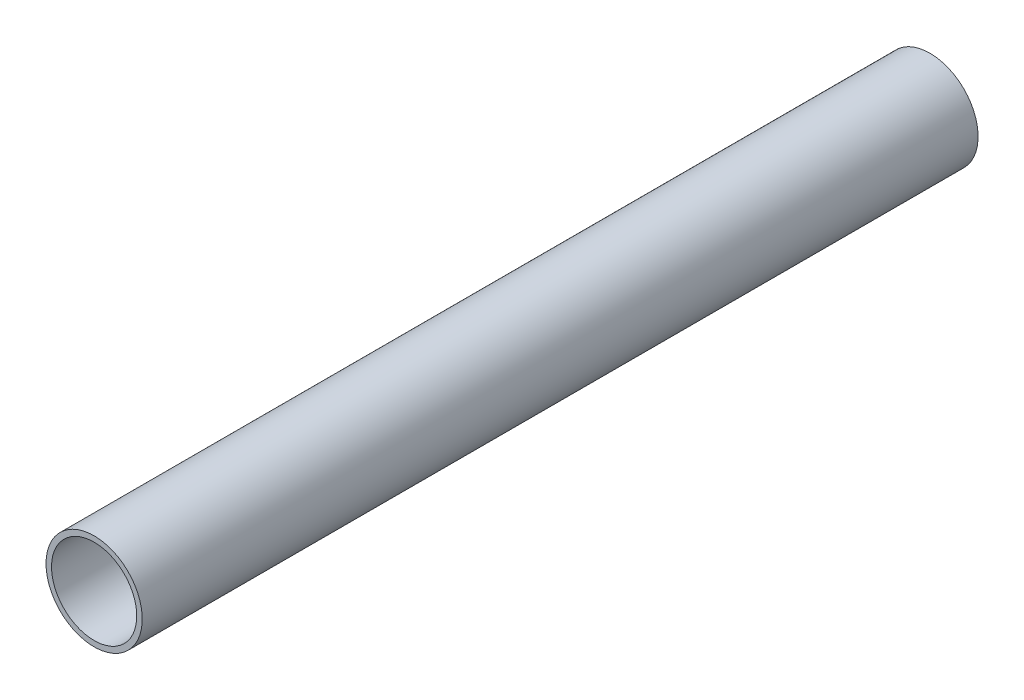
ISO-10303-21;
HEADER;
FILE_DESCRIPTION(('STEP AP214'),'2;1');
FILE_NAME('part.step','',(''),(''),'','','');
FILE_SCHEMA(('AUTOMOTIVE_DESIGN { 1 0 10303 214 1 1 1 1 }'));
ENDSEC;
DATA;
#1=APPLICATION_CONTEXT('core data for automotive mechanical design processes');
#2=APPLICATION_PROTOCOL_DEFINITION('international standard','automotive_design',2000,#1);
#3=PRODUCT_CONTEXT('',#1,'mechanical');
#4=PRODUCT('Part','Part','',(#3));
#5=PRODUCT_RELATED_PRODUCT_CATEGORY('part','',(#4));
#6=PRODUCT_DEFINITION_FORMATION('','',#4);
#7=PRODUCT_DEFINITION_CONTEXT('part definition',#1,'design');
#8=PRODUCT_DEFINITION('design','',#6,#7);
#9=PRODUCT_DEFINITION_SHAPE('','',#8);
#10=(LENGTH_UNIT() NAMED_UNIT(*) SI_UNIT(.MILLI.,.METRE.));
#11=(NAMED_UNIT(*) PLANE_ANGLE_UNIT() SI_UNIT($,.RADIAN.));
#12=(NAMED_UNIT(*) SI_UNIT($,.STERADIAN.) SOLID_ANGLE_UNIT());
#13=UNCERTAINTY_MEASURE_WITH_UNIT(LENGTH_MEASURE(1.E-05),#10,'distance_accuracy_value','');
#14=(GEOMETRIC_REPRESENTATION_CONTEXT(3) GLOBAL_UNCERTAINTY_ASSIGNED_CONTEXT((#13)) GLOBAL_UNIT_ASSIGNED_CONTEXT((#10,
#11,#12)) REPRESENTATION_CONTEXT('',''));
#15=CARTESIAN_POINT('',(0.,0.,0.));
#16=DIRECTION('',(0.,0.,1.));
#17=DIRECTION('',(1.,0.,0.));
#18=AXIS2_PLACEMENT_3D('',#15,#16,#17);
#19=CARTESIAN_POINT('',(0.,0.,455.));
#20=DIRECTION('',(0.,0.,1.));
#21=DIRECTION('',(1.,0.,0.));
#22=AXIS2_PLACEMENT_3D('',#19,#20,#21);
#23=PLANE('',#22);
#24=CARTESIAN_POINT('',(0.,0.,455.));
#25=DIRECTION('',(0.,0.,1.));
#26=DIRECTION('',(1.,0.,0.));
#27=AXIS2_PLACEMENT_3D('',#24,#25,#26);
#28=CIRCLE('',#27,26.2);
#29=CARTESIAN_POINT('',(-26.2,0.,455.));
#30=VERTEX_POINT('',#29);
#31=EDGE_CURVE('E10',#30,#30,#28,.T.);
#32=ORIENTED_EDGE('',*,*,#31,.T.);
#33=EDGE_LOOP('',(#32));
#34=FACE_BOUND('',#33,.T.);
#35=CARTESIAN_POINT('',(0.,0.,455.));
#36=DIRECTION('',(0.,0.,1.));
#37=DIRECTION('',(1.,0.,0.));
#38=AXIS2_PLACEMENT_3D('',#35,#36,#37);
#39=CIRCLE('',#38,23.2);
#40=CARTESIAN_POINT('',(-23.2,0.,455.));
#41=VERTEX_POINT('',#40);
#42=EDGE_CURVE('E51',#41,#41,#39,.T.);
#43=ORIENTED_EDGE('',*,*,#42,.F.);
#44=EDGE_LOOP('',(#43));
#45=FACE_BOUND('',#44,.T.);
#46=ADVANCED_FACE('F37',(#34,#45),#23,.T.);
#47=CARTESIAN_POINT('',(0.,0.,0.));
#48=DIRECTION('',(0.,0.,1.));
#49=DIRECTION('',(1.,0.,0.));
#50=AXIS2_PLACEMENT_3D('',#47,#48,#49);
#51=PLANE('',#50);
#52=CARTESIAN_POINT('',(0.,0.,0.));
#53=DIRECTION('',(0.,0.,1.));
#54=DIRECTION('',(1.,0.,0.));
#55=AXIS2_PLACEMENT_3D('',#52,#53,#54);
#56=CIRCLE('',#55,26.2);
#57=CARTESIAN_POINT('',(-26.2,0.,0.));
#58=VERTEX_POINT('',#57);
#59=EDGE_CURVE('E41',#58,#58,#56,.T.);
#60=ORIENTED_EDGE('',*,*,#59,.F.);
#61=EDGE_LOOP('',(#60));
#62=FACE_BOUND('',#61,.T.);
#63=CARTESIAN_POINT('',(0.,0.,0.));
#64=DIRECTION('',(0.,0.,1.));
#65=DIRECTION('',(1.,0.,0.));
#66=AXIS2_PLACEMENT_3D('',#63,#64,#65);
#67=CIRCLE('',#66,23.2);
#68=CARTESIAN_POINT('',(-23.2,0.,0.));
#69=VERTEX_POINT('',#68);
#70=EDGE_CURVE('E53',#69,#69,#67,.T.);
#71=ORIENTED_EDGE('',*,*,#70,.T.);
#72=EDGE_LOOP('',(#71));
#73=FACE_BOUND('',#72,.T.);
#74=ADVANCED_FACE('F66',(#62,#73),#51,.F.);
#75=CARTESIAN_POINT('',(0.,0.,455.));
#76=DIRECTION('',(0.,0.,-1.));
#77=DIRECTION('',(-1.,0.,0.));
#78=AXIS2_PLACEMENT_3D('',#75,#76,#77);
#79=CYLINDRICAL_SURFACE('',#78,26.2);
#80=CARTESIAN_POINT('',(-26.2,0.,455.));
#81=CARTESIAN_POINT('',(-26.2,0.,450.260416666667));
#82=CARTESIAN_POINT('',(-26.2,0.,445.520833333333));
#83=CARTESIAN_POINT('',(-26.2,0.,436.041666666667));
#84=CARTESIAN_POINT('',(-26.2,0.,431.302083333333));
#85=CARTESIAN_POINT('',(-26.2,0.,421.822916666667));
#86=CARTESIAN_POINT('',(-26.2,0.,417.083333333333));
#87=CARTESIAN_POINT('',(-26.2,0.,407.604166666667));
#88=CARTESIAN_POINT('',(-26.2,0.,402.864583333333));
#89=CARTESIAN_POINT('',(-26.2,0.,393.385416666667));
#90=CARTESIAN_POINT('',(-26.2,0.,388.645833333333));
#91=CARTESIAN_POINT('',(-26.2,0.,379.166666666667));
#92=CARTESIAN_POINT('',(-26.2,0.,374.427083333333));
#93=CARTESIAN_POINT('',(-26.2,0.,364.947916666667));
#94=CARTESIAN_POINT('',(-26.2,0.,360.208333333333));
#95=CARTESIAN_POINT('',(-26.2,0.,350.729166666667));
#96=CARTESIAN_POINT('',(-26.2,0.,345.989583333333));
#97=CARTESIAN_POINT('',(-26.2,0.,336.510416666667));
#98=CARTESIAN_POINT('',(-26.2,0.,331.770833333333));
#99=CARTESIAN_POINT('',(-26.2,0.,322.291666666667));
#100=CARTESIAN_POINT('',(-26.2,0.,317.552083333333));
#101=CARTESIAN_POINT('',(-26.2,0.,308.072916666667));
#102=CARTESIAN_POINT('',(-26.2,0.,303.333333333333));
#103=CARTESIAN_POINT('',(-26.2,0.,293.854166666667));
#104=CARTESIAN_POINT('',(-26.2,0.,289.114583333333));
#105=CARTESIAN_POINT('',(-26.2,0.,279.635416666667));
#106=CARTESIAN_POINT('',(-26.2,0.,274.895833333333));
#107=CARTESIAN_POINT('',(-26.2,0.,265.416666666667));
#108=CARTESIAN_POINT('',(-26.2,0.,260.677083333333));
#109=CARTESIAN_POINT('',(-26.2,0.,251.197916666667));
#110=CARTESIAN_POINT('',(-26.2,0.,246.458333333333));
#111=CARTESIAN_POINT('',(-26.2,0.,236.979166666667));
#112=CARTESIAN_POINT('',(-26.2,0.,232.239583333333));
#113=CARTESIAN_POINT('',(-26.2,0.,222.760416666667));
#114=CARTESIAN_POINT('',(-26.2,0.,218.020833333333));
#115=CARTESIAN_POINT('',(-26.2,0.,208.541666666667));
#116=CARTESIAN_POINT('',(-26.2,0.,203.802083333333));
#117=CARTESIAN_POINT('',(-26.2,0.,194.322916666667));
#118=CARTESIAN_POINT('',(-26.2,0.,189.583333333333));
#119=CARTESIAN_POINT('',(-26.2,0.,180.104166666667));
#120=CARTESIAN_POINT('',(-26.2,0.,175.364583333333));
#121=CARTESIAN_POINT('',(-26.2,0.,165.885416666667));
#122=CARTESIAN_POINT('',(-26.2,0.,161.145833333333));
#123=CARTESIAN_POINT('',(-26.2,0.,151.666666666667));
#124=CARTESIAN_POINT('',(-26.2,0.,146.927083333333));
#125=CARTESIAN_POINT('',(-26.2,0.,137.447916666667));
#126=CARTESIAN_POINT('',(-26.2,0.,132.708333333333));
#127=CARTESIAN_POINT('',(-26.2,0.,123.229166666667));
#128=CARTESIAN_POINT('',(-26.2,0.,118.489583333333));
#129=CARTESIAN_POINT('',(-26.2,0.,109.010416666667));
#130=CARTESIAN_POINT('',(-26.2,0.,104.270833333333));
#131=CARTESIAN_POINT('',(-26.2,0.,94.7916666666667));
#132=CARTESIAN_POINT('',(-26.2,0.,90.0520833333334));
#133=CARTESIAN_POINT('',(-26.2,0.,80.5729166666667));
#134=CARTESIAN_POINT('',(-26.2,0.,75.8333333333333));
#135=CARTESIAN_POINT('',(-26.2,0.,66.3541666666667));
#136=CARTESIAN_POINT('',(-26.2,0.,61.6145833333333));
#137=CARTESIAN_POINT('',(-26.2,0.,52.1354166666667));
#138=CARTESIAN_POINT('',(-26.2,0.,47.3958333333333));
#139=CARTESIAN_POINT('',(-26.2,0.,37.9166666666667));
#140=CARTESIAN_POINT('',(-26.2,0.,33.1770833333333));
#141=CARTESIAN_POINT('',(-26.2,0.,23.6979166666667));
#142=CARTESIAN_POINT('',(-26.2,0.,18.9583333333333));
#143=CARTESIAN_POINT('',(-26.2,0.,9.47916666666667));
#144=CARTESIAN_POINT('',(-26.2,0.,4.73958333333333));
#145=CARTESIAN_POINT('',(-26.2,0.,0.));
#146=B_SPLINE_CURVE_WITH_KNOTS('',3,(#80,#81,#82,#83,#84,#85,#86,#87,#88,#89,#90,#91,#92,#93,
#94,#95,#96,#97,#98,#99,#100,#101,#102,#103,#104,#105,#106,#107,#108,#109,#110,#111,#112,#113,
#114,#115,#116,#117,#118,#119,#120,#121,#122,#123,#124,#125,#126,#127,#128,#129,#130,#131,#132,
#133,#134,#135,#136,#137,#138,#139,#140,#141,#142,#143,#144,#145),.UNSPECIFIED.,.F.,.F.,(4,2,2,
2,2,2,2,2,2,2,2,2,2,2,2,2,2,2,2,2,2,2,2,2,2,2,2,2,2,2,2,2,4),(0.,14.21875,28.4375,42.65625,
56.875,71.09375,85.3125,99.53125,113.75,127.96875,142.1875,156.40625,170.625,184.84375,199.0625,
213.28125,227.5,241.71875,255.9375,270.15625,284.375,298.59375,312.8125,327.03125,341.25,
355.46875,369.6875,383.90625,398.125,412.34375,426.5625,440.78125,455.),.UNSPECIFIED.);
#147=EDGE_CURVE('BSEAM39',#30,#58,#146,.T.);
#148=ORIENTED_EDGE('',*,*,#31,.F.);
#149=ORIENTED_EDGE('',*,*,#59,.T.);
#150=ORIENTED_EDGE('',*,*,#147,.T.);
#151=ORIENTED_EDGE('',*,*,#147,.F.);
#152=EDGE_LOOP('',(#148,#150,#149,#151));
#153=FACE_BOUND('',#152,.T.);
#154=ADVANCED_FACE('F39',(#153),#79,.T.);
#155=CARTESIAN_POINT('',(0.,0.,455.));
#156=DIRECTION('',(0.,0.,-1.));
#157=DIRECTION('',(-1.,0.,0.));
#158=AXIS2_PLACEMENT_3D('',#155,#156,#157);
#159=CYLINDRICAL_SURFACE('',#158,23.2);
#160=CARTESIAN_POINT('',(-23.2,0.,455.));
#161=CARTESIAN_POINT('',(-23.2,0.,450.260416666667));
#162=CARTESIAN_POINT('',(-23.2,0.,445.520833333333));
#163=CARTESIAN_POINT('',(-23.2,0.,436.041666666667));
#164=CARTESIAN_POINT('',(-23.2,0.,431.302083333333));
#165=CARTESIAN_POINT('',(-23.2,0.,421.822916666667));
#166=CARTESIAN_POINT('',(-23.2,0.,417.083333333333));
#167=CARTESIAN_POINT('',(-23.2,0.,407.604166666667));
#168=CARTESIAN_POINT('',(-23.2,0.,402.864583333333));
#169=CARTESIAN_POINT('',(-23.2,0.,393.385416666667));
#170=CARTESIAN_POINT('',(-23.2,0.,388.645833333333));
#171=CARTESIAN_POINT('',(-23.2,0.,379.166666666667));
#172=CARTESIAN_POINT('',(-23.2,0.,374.427083333333));
#173=CARTESIAN_POINT('',(-23.2,0.,364.947916666667));
#174=CARTESIAN_POINT('',(-23.2,0.,360.208333333333));
#175=CARTESIAN_POINT('',(-23.2,0.,350.729166666667));
#176=CARTESIAN_POINT('',(-23.2,0.,345.989583333333));
#177=CARTESIAN_POINT('',(-23.2,0.,336.510416666667));
#178=CARTESIAN_POINT('',(-23.2,0.,331.770833333333));
#179=CARTESIAN_POINT('',(-23.2,0.,322.291666666667));
#180=CARTESIAN_POINT('',(-23.2,0.,317.552083333333));
#181=CARTESIAN_POINT('',(-23.2,0.,308.072916666667));
#182=CARTESIAN_POINT('',(-23.2,0.,303.333333333333));
#183=CARTESIAN_POINT('',(-23.2,0.,293.854166666667));
#184=CARTESIAN_POINT('',(-23.2,0.,289.114583333333));
#185=CARTESIAN_POINT('',(-23.2,0.,279.635416666667));
#186=CARTESIAN_POINT('',(-23.2,0.,274.895833333333));
#187=CARTESIAN_POINT('',(-23.2,0.,265.416666666667));
#188=CARTESIAN_POINT('',(-23.2,0.,260.677083333333));
#189=CARTESIAN_POINT('',(-23.2,0.,251.197916666667));
#190=CARTESIAN_POINT('',(-23.2,0.,246.458333333333));
#191=CARTESIAN_POINT('',(-23.2,0.,236.979166666667));
#192=CARTESIAN_POINT('',(-23.2,0.,232.239583333333));
#193=CARTESIAN_POINT('',(-23.2,0.,222.760416666667));
#194=CARTESIAN_POINT('',(-23.2,0.,218.020833333333));
#195=CARTESIAN_POINT('',(-23.2,0.,208.541666666667));
#196=CARTESIAN_POINT('',(-23.2,0.,203.802083333333));
#197=CARTESIAN_POINT('',(-23.2,0.,194.322916666667));
#198=CARTESIAN_POINT('',(-23.2,0.,189.583333333333));
#199=CARTESIAN_POINT('',(-23.2,0.,180.104166666667));
#200=CARTESIAN_POINT('',(-23.2,0.,175.364583333333));
#201=CARTESIAN_POINT('',(-23.2,0.,165.885416666667));
#202=CARTESIAN_POINT('',(-23.2,0.,161.145833333333));
#203=CARTESIAN_POINT('',(-23.2,0.,151.666666666667));
#204=CARTESIAN_POINT('',(-23.2,0.,146.927083333333));
#205=CARTESIAN_POINT('',(-23.2,0.,137.447916666667));
#206=CARTESIAN_POINT('',(-23.2,0.,132.708333333333));
#207=CARTESIAN_POINT('',(-23.2,0.,123.229166666667));
#208=CARTESIAN_POINT('',(-23.2,0.,118.489583333333));
#209=CARTESIAN_POINT('',(-23.2,0.,109.010416666667));
#210=CARTESIAN_POINT('',(-23.2,0.,104.270833333333));
#211=CARTESIAN_POINT('',(-23.2,0.,94.7916666666667));
#212=CARTESIAN_POINT('',(-23.2,0.,90.0520833333334));
#213=CARTESIAN_POINT('',(-23.2,0.,80.5729166666667));
#214=CARTESIAN_POINT('',(-23.2,0.,75.8333333333333));
#215=CARTESIAN_POINT('',(-23.2,0.,66.3541666666667));
#216=CARTESIAN_POINT('',(-23.2,0.,61.6145833333333));
#217=CARTESIAN_POINT('',(-23.2,0.,52.1354166666667));
#218=CARTESIAN_POINT('',(-23.2,0.,47.3958333333333));
#219=CARTESIAN_POINT('',(-23.2,0.,37.9166666666667));
#220=CARTESIAN_POINT('',(-23.2,0.,33.1770833333333));
#221=CARTESIAN_POINT('',(-23.2,0.,23.6979166666667));
#222=CARTESIAN_POINT('',(-23.2,0.,18.9583333333333));
#223=CARTESIAN_POINT('',(-23.2,0.,9.47916666666667));
#224=CARTESIAN_POINT('',(-23.2,0.,4.73958333333333));
#225=CARTESIAN_POINT('',(-23.2,0.,0.));
#226=B_SPLINE_CURVE_WITH_KNOTS('',3,(#160,#161,#162,#163,#164,#165,#166,#167,#168,#169,#170,
#171,#172,#173,#174,#175,#176,#177,#178,#179,#180,#181,#182,#183,#184,#185,#186,#187,#188,#189,
#190,#191,#192,#193,#194,#195,#196,#197,#198,#199,#200,#201,#202,#203,#204,#205,#206,#207,#208,
#209,#210,#211,#212,#213,#214,#215,#216,#217,#218,#219,#220,#221,#222,#223,#224,#225),
.UNSPECIFIED.,.F.,.F.,(4,2,2,2,2,2,2,2,2,2,2,2,2,2,2,2,2,2,2,2,2,2,2,2,2,2,2,2,2,2,2,2,4),(0.,
14.21875,28.4375,42.65625,56.875,71.09375,85.3125,99.53125,113.75,127.96875,142.1875,156.40625,
170.625,184.84375,199.0625,213.28125,227.5,241.71875,255.9375,270.15625,284.375,298.59375,
312.8125,327.03125,341.25,355.46875,369.6875,383.90625,398.125,412.34375,426.5625,440.78125,
455.),.UNSPECIFIED.);
#227=EDGE_CURVE('BSEAM62',#41,#69,#226,.T.);
#228=ORIENTED_EDGE('',*,*,#42,.T.);
#229=ORIENTED_EDGE('',*,*,#70,.F.);
#230=ORIENTED_EDGE('',*,*,#227,.T.);
#231=ORIENTED_EDGE('',*,*,#227,.F.);
#232=EDGE_LOOP('',(#228,#230,#229,#231));
#233=FACE_BOUND('',#232,.T.);
#234=ADVANCED_FACE('F62',(#233),#159,.F.);
#235=CLOSED_SHELL('',(#46,#74,#154,#234));
#236=MANIFOLD_SOLID_BREP('B2',#235);
#237=ADVANCED_BREP_SHAPE_REPRESENTATION('',(#18,#236),#14);
#238=SHAPE_DEFINITION_REPRESENTATION(#9,#237);
ENDSEC;
END-ISO-10303-21;
